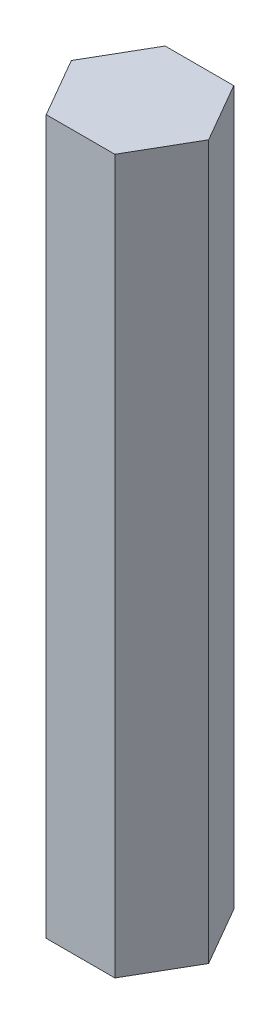
ISO-10303-21;
HEADER;
FILE_DESCRIPTION(('STEP AP214'),'2;1');
FILE_NAME('part.step','',(''),(''),'','','');
FILE_SCHEMA(('AUTOMOTIVE_DESIGN { 1 0 10303 214 1 1 1 1 }'));
ENDSEC;
DATA;
#1=APPLICATION_CONTEXT('core data for automotive mechanical design processes');
#2=APPLICATION_PROTOCOL_DEFINITION('international standard','automotive_design',2000,#1);
#3=PRODUCT_CONTEXT('',#1,'mechanical');
#4=PRODUCT('Part','Part','',(#3));
#5=PRODUCT_RELATED_PRODUCT_CATEGORY('part','',(#4));
#6=PRODUCT_DEFINITION_FORMATION('','',#4);
#7=PRODUCT_DEFINITION_CONTEXT('part definition',#1,'design');
#8=PRODUCT_DEFINITION('design','',#6,#7);
#9=PRODUCT_DEFINITION_SHAPE('','',#8);
#10=(LENGTH_UNIT() NAMED_UNIT(*) SI_UNIT(.MILLI.,.METRE.));
#11=(NAMED_UNIT(*) PLANE_ANGLE_UNIT() SI_UNIT($,.RADIAN.));
#12=(NAMED_UNIT(*) SI_UNIT($,.STERADIAN.) SOLID_ANGLE_UNIT());
#13=UNCERTAINTY_MEASURE_WITH_UNIT(LENGTH_MEASURE(1.E-05),#10,'distance_accuracy_value','');
#14=(GEOMETRIC_REPRESENTATION_CONTEXT(3) GLOBAL_UNCERTAINTY_ASSIGNED_CONTEXT((#13)) GLOBAL_UNIT_ASSIGNED_CONTEXT((#10,
#11,#12)) REPRESENTATION_CONTEXT('',''));
#15=CARTESIAN_POINT('',(0.,0.,0.));
#16=DIRECTION('',(0.,0.,1.));
#17=DIRECTION('',(1.,0.,0.));
#18=AXIS2_PLACEMENT_3D('',#15,#16,#17);
#19=CARTESIAN_POINT('',(1.44337567297409,30.,2.49999999999997));
#20=DIRECTION('',(-0.866025403784441,0.,-0.499999999999995));
#21=DIRECTION('',(-0.499999999999995,0.,0.866025403784441));
#22=AXIS2_PLACEMENT_3D('',#19,#20,#21);
#23=PLANE('',#22);
#24=DIRECTION('',(0.499999999999995,0.,-0.866025403784441));
#25=VECTOR('',#24,1.);
#26=CARTESIAN_POINT('',(1.44337567297409,0.,2.49999999999997));
#27=LINE('',#26,#25);
#28=CARTESIAN_POINT('',(1.44337567297409,0.,2.49999999999997));
#29=VERTEX_POINT('',#28);
#30=CARTESIAN_POINT('',(2.88675134594811,0.,0.));
#31=VERTEX_POINT('',#30);
#32=EDGE_CURVE('E128',#29,#31,#27,.T.);
#33=ORIENTED_EDGE('',*,*,#32,.T.);
#34=DIRECTION('',(0.,-1.,0.));
#35=VECTOR('',#34,1.);
#36=CARTESIAN_POINT('',(2.88675134594811,30.,0.));
#37=LINE('',#36,#35);
#38=CARTESIAN_POINT('',(2.88675134594811,30.,0.));
#39=VERTEX_POINT('',#38);
#40=EDGE_CURVE('E11',#39,#31,#37,.T.);
#41=ORIENTED_EDGE('',*,*,#40,.F.);
#42=DIRECTION('',(0.499999999999995,0.,-0.866025403784441));
#43=VECTOR('',#42,1.);
#44=CARTESIAN_POINT('',(1.44337567297409,30.,2.49999999999997));
#45=LINE('',#44,#43);
#46=CARTESIAN_POINT('',(1.44337567297409,30.,2.49999999999997));
#47=VERTEX_POINT('',#46);
#48=EDGE_CURVE('E138',#47,#39,#45,.T.);
#49=ORIENTED_EDGE('',*,*,#48,.F.);
#50=DIRECTION('',(0.,-1.,0.));
#51=VECTOR('',#50,1.);
#52=CARTESIAN_POINT('',(1.44337567297409,30.,2.49999999999997));
#53=LINE('',#52,#51);
#54=EDGE_CURVE('E124',#47,#29,#53,.T.);
#55=ORIENTED_EDGE('',*,*,#54,.T.);
#56=EDGE_LOOP('',(#33,#41,#49,#55));
#57=FACE_BOUND('',#56,.T.);
#58=ADVANCED_FACE('F43',(#57),#23,.F.);
#59=CARTESIAN_POINT('',(2.88675134594811,30.,0.));
#60=DIRECTION('',(-0.866025403784438,0.,0.500000000000001));
#61=DIRECTION('',(0.500000000000001,0.,0.866025403784438));
#62=AXIS2_PLACEMENT_3D('',#59,#60,#61);
#63=PLANE('',#62);
#64=DIRECTION('',(-0.500000000000001,0.,-0.866025403784438));
#65=VECTOR('',#64,1.);
#66=CARTESIAN_POINT('',(2.88675134594811,0.,0.));
#67=LINE('',#66,#65);
#68=CARTESIAN_POINT('',(1.44337567297405,0.,-2.49999999999999));
#69=VERTEX_POINT('',#68);
#70=EDGE_CURVE('E131',#31,#69,#67,.T.);
#71=ORIENTED_EDGE('',*,*,#70,.T.);
#72=DIRECTION('',(0.,-1.,0.));
#73=VECTOR('',#72,1.);
#74=CARTESIAN_POINT('',(1.44337567297405,30.,-2.49999999999999));
#75=LINE('',#74,#73);
#76=CARTESIAN_POINT('',(1.44337567297405,30.,-2.49999999999999));
#77=VERTEX_POINT('',#76);
#78=EDGE_CURVE('E52',#77,#69,#75,.T.);
#79=ORIENTED_EDGE('',*,*,#78,.F.);
#80=DIRECTION('',(-0.500000000000001,0.,-0.866025403784438));
#81=VECTOR('',#80,1.);
#82=CARTESIAN_POINT('',(2.88675134594811,30.,0.));
#83=LINE('',#82,#81);
#84=EDGE_CURVE('E97',#39,#77,#83,.T.);
#85=ORIENTED_EDGE('',*,*,#84,.F.);
#86=ORIENTED_EDGE('',*,*,#40,.T.);
#87=EDGE_LOOP('',(#71,#79,#85,#86));
#88=FACE_BOUND('',#87,.T.);
#89=ADVANCED_FACE('F164',(#88),#63,.F.);
#90=CARTESIAN_POINT('',(1.44337567297405,30.,-2.49999999999999));
#91=DIRECTION('',(0.,0.,1.));
#92=DIRECTION('',(1.,0.,0.));
#93=AXIS2_PLACEMENT_3D('',#90,#91,#92);
#94=PLANE('',#93);
#95=DIRECTION('',(-1.,0.,0.));
#96=VECTOR('',#95,1.);
#97=CARTESIAN_POINT('',(1.44337567297405,0.,-2.49999999999999));
#98=LINE('',#97,#96);
#99=CARTESIAN_POINT('',(-1.44337567297407,0.,-2.49999999999998));
#100=VERTEX_POINT('',#99);
#101=EDGE_CURVE('E133',#69,#100,#98,.T.);
#102=ORIENTED_EDGE('',*,*,#101,.T.);
#103=DIRECTION('',(0.,-1.,0.));
#104=VECTOR('',#103,1.);
#105=CARTESIAN_POINT('',(-1.44337567297407,30.,-2.49999999999998));
#106=LINE('',#105,#104);
#107=CARTESIAN_POINT('',(-1.44337567297407,30.,-2.49999999999998));
#108=VERTEX_POINT('',#107);
#109=EDGE_CURVE('E119',#108,#100,#106,.T.);
#110=ORIENTED_EDGE('',*,*,#109,.F.);
#111=DIRECTION('',(-1.,0.,0.));
#112=VECTOR('',#111,1.);
#113=CARTESIAN_POINT('',(1.44337567297405,30.,-2.49999999999999));
#114=LINE('',#113,#112);
#115=EDGE_CURVE('E110',#77,#108,#114,.T.);
#116=ORIENTED_EDGE('',*,*,#115,.F.);
#117=ORIENTED_EDGE('',*,*,#78,.T.);
#118=EDGE_LOOP('',(#102,#110,#116,#117));
#119=FACE_BOUND('',#118,.T.);
#120=ADVANCED_FACE('F146',(#119),#94,.F.);
#121=CARTESIAN_POINT('',(-1.44337567297407,30.,-2.49999999999998));
#122=DIRECTION('',(0.866025403784442,0.,0.499999999999995));
#123=DIRECTION('',(0.499999999999995,0.,-0.866025403784442));
#124=AXIS2_PLACEMENT_3D('',#121,#122,#123);
#125=PLANE('',#124);
#126=DIRECTION('',(-0.499999999999995,0.,0.866025403784442));
#127=VECTOR('',#126,1.);
#128=CARTESIAN_POINT('',(-1.44337567297407,0.,-2.49999999999998));
#129=LINE('',#128,#127);
#130=CARTESIAN_POINT('',(-2.88675134594811,0.,0.));
#131=VERTEX_POINT('',#130);
#132=EDGE_CURVE('E118',#100,#131,#129,.T.);
#133=ORIENTED_EDGE('',*,*,#132,.T.);
#134=DIRECTION('',(0.,-1.,0.));
#135=VECTOR('',#134,1.);
#136=CARTESIAN_POINT('',(-2.88675134594811,30.,0.));
#137=LINE('',#136,#135);
#138=CARTESIAN_POINT('',(-2.88675134594811,30.,0.));
#139=VERTEX_POINT('',#138);
#140=EDGE_CURVE('E115',#139,#131,#137,.T.);
#141=ORIENTED_EDGE('',*,*,#140,.F.);
#142=DIRECTION('',(-0.499999999999995,0.,0.866025403784442));
#143=VECTOR('',#142,1.);
#144=CARTESIAN_POINT('',(-1.44337567297407,30.,-2.49999999999998));
#145=LINE('',#144,#143);
#146=EDGE_CURVE('E104',#108,#139,#145,.T.);
#147=ORIENTED_EDGE('',*,*,#146,.F.);
#148=ORIENTED_EDGE('',*,*,#109,.T.);
#149=EDGE_LOOP('',(#133,#141,#147,#148));
#150=FACE_BOUND('',#149,.T.);
#151=ADVANCED_FACE('F116',(#150),#125,.F.);
#152=CARTESIAN_POINT('',(-2.88675134594811,30.,0.));
#153=DIRECTION('',(0.866025403784435,0.,-0.500000000000007));
#154=DIRECTION('',(-0.500000000000007,0.,-0.866025403784435));
#155=AXIS2_PLACEMENT_3D('',#152,#153,#154);
#156=PLANE('',#155);
#157=DIRECTION('',(0.500000000000007,0.,0.866025403784435));
#158=VECTOR('',#157,1.);
#159=CARTESIAN_POINT('',(-2.88675134594811,0.,0.));
#160=LINE('',#159,#158);
#161=CARTESIAN_POINT('',(-1.44337567297403,0.,2.5));
#162=VERTEX_POINT('',#161);
#163=EDGE_CURVE('E83',#131,#162,#160,.T.);
#164=ORIENTED_EDGE('',*,*,#163,.T.);
#165=DIRECTION('',(0.,-1.,0.));
#166=VECTOR('',#165,1.);
#167=CARTESIAN_POINT('',(-1.44337567297403,30.,2.5));
#168=LINE('',#167,#166);
#169=CARTESIAN_POINT('',(-1.44337567297403,30.,2.5));
#170=VERTEX_POINT('',#169);
#171=EDGE_CURVE('E120',#170,#162,#168,.T.);
#172=ORIENTED_EDGE('',*,*,#171,.F.);
#173=DIRECTION('',(0.500000000000007,0.,0.866025403784435));
#174=VECTOR('',#173,1.);
#175=CARTESIAN_POINT('',(-2.88675134594811,30.,0.));
#176=LINE('',#175,#174);
#177=EDGE_CURVE('E108',#139,#170,#176,.T.);
#178=ORIENTED_EDGE('',*,*,#177,.F.);
#179=ORIENTED_EDGE('',*,*,#140,.T.);
#180=EDGE_LOOP('',(#164,#172,#178,#179));
#181=FACE_BOUND('',#180,.T.);
#182=ADVANCED_FACE('F122',(#181),#156,.F.);
#183=CARTESIAN_POINT('',(-1.44337567297403,30.,2.5));
#184=DIRECTION('',(0.,0.,-1.));
#185=DIRECTION('',(-1.,0.,0.));
#186=AXIS2_PLACEMENT_3D('',#183,#184,#185);
#187=PLANE('',#186);
#188=DIRECTION('',(1.,0.,0.));
#189=VECTOR('',#188,1.);
#190=CARTESIAN_POINT('',(-1.44337567297403,0.,2.5));
#191=LINE('',#190,#189);
#192=EDGE_CURVE('E89',#162,#29,#191,.T.);
#193=ORIENTED_EDGE('',*,*,#192,.T.);
#194=ORIENTED_EDGE('',*,*,#54,.F.);
#195=DIRECTION('',(1.,0.,0.));
#196=VECTOR('',#195,1.);
#197=CARTESIAN_POINT('',(-1.44337567297403,30.,2.5));
#198=LINE('',#197,#196);
#199=EDGE_CURVE('E60',#170,#47,#198,.T.);
#200=ORIENTED_EDGE('',*,*,#199,.F.);
#201=ORIENTED_EDGE('',*,*,#171,.T.);
#202=EDGE_LOOP('',(#193,#194,#200,#201));
#203=FACE_BOUND('',#202,.T.);
#204=ADVANCED_FACE('F153',(#203),#187,.F.);
#205=CARTESIAN_POINT('',(0.,30.,0.));
#206=DIRECTION('',(0.,1.,0.));
#207=DIRECTION('',(0.,0.,1.));
#208=AXIS2_PLACEMENT_3D('',#205,#206,#207);
#209=PLANE('',#208);
#210=ORIENTED_EDGE('',*,*,#48,.T.);
#211=ORIENTED_EDGE('',*,*,#84,.T.);
#212=ORIENTED_EDGE('',*,*,#115,.T.);
#213=ORIENTED_EDGE('',*,*,#146,.T.);
#214=ORIENTED_EDGE('',*,*,#177,.T.);
#215=ORIENTED_EDGE('',*,*,#199,.T.);
#216=EDGE_LOOP('',(#210,#211,#212,#213,#214,#215));
#217=FACE_BOUND('',#216,.T.);
#218=ADVANCED_FACE('F106',(#217),#209,.T.);
#219=CARTESIAN_POINT('',(0.,0.,0.));
#220=DIRECTION('',(0.,1.,0.));
#221=DIRECTION('',(0.,0.,1.));
#222=AXIS2_PLACEMENT_3D('',#219,#220,#221);
#223=PLANE('',#222);
#224=ORIENTED_EDGE('',*,*,#32,.F.);
#225=ORIENTED_EDGE('',*,*,#192,.F.);
#226=ORIENTED_EDGE('',*,*,#163,.F.);
#227=ORIENTED_EDGE('',*,*,#132,.F.);
#228=ORIENTED_EDGE('',*,*,#101,.F.);
#229=ORIENTED_EDGE('',*,*,#70,.F.);
#230=EDGE_LOOP('',(#224,#225,#226,#227,#228,#229));
#231=FACE_BOUND('',#230,.T.);
#232=ADVANCED_FACE('F149',(#231),#223,.F.);
#233=CLOSED_SHELL('',(#58,#89,#120,#151,#182,#204,#218,#232));
#234=MANIFOLD_SOLID_BREP('B2',#233);
#235=ADVANCED_BREP_SHAPE_REPRESENTATION('',(#18,#234),#14);
#236=SHAPE_DEFINITION_REPRESENTATION(#9,#235);
ENDSEC;
END-ISO-10303-21;
